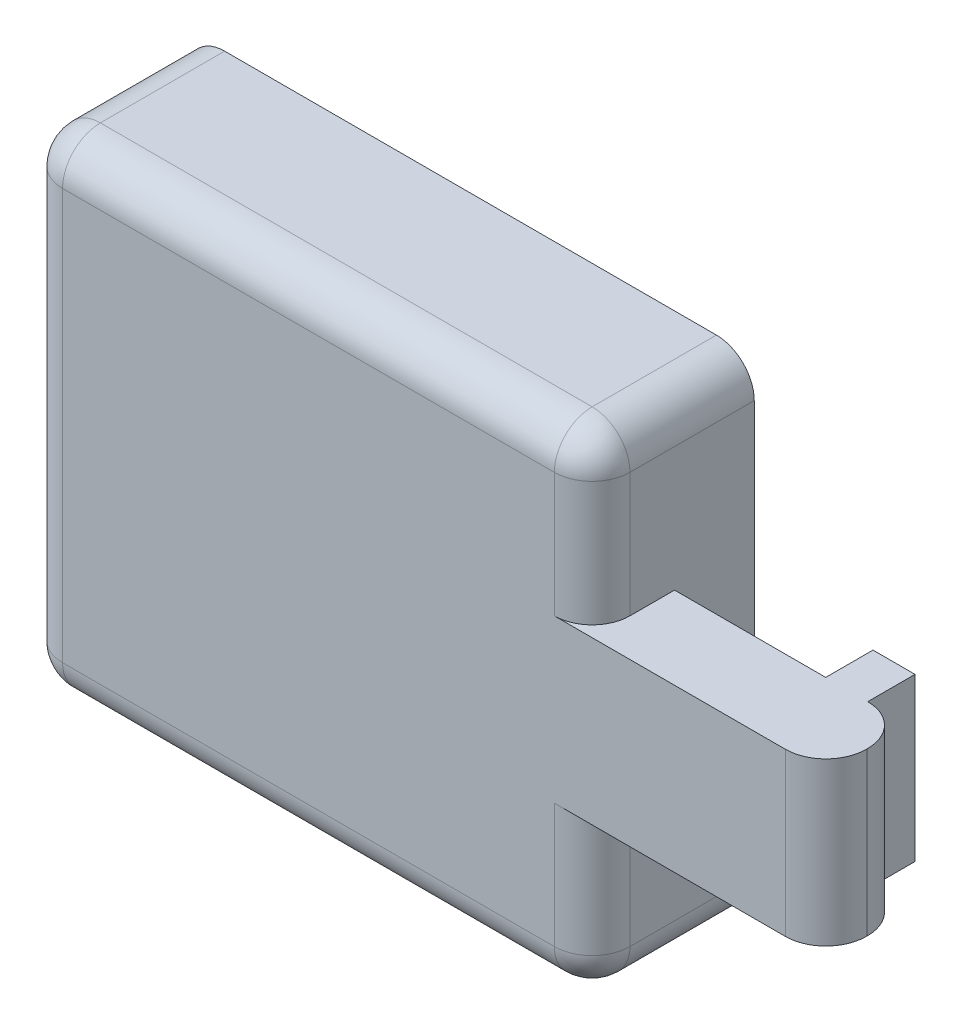
ISO-10303-21;
HEADER;
FILE_DESCRIPTION(('STEP AP214'),'2;1');
FILE_NAME('part.step','',(''),(''),'','','');
FILE_SCHEMA(('AUTOMOTIVE_DESIGN { 1 0 10303 214 1 1 1 1 }'));
ENDSEC;
DATA;
#1=APPLICATION_CONTEXT('core data for automotive mechanical design processes');
#2=APPLICATION_PROTOCOL_DEFINITION('international standard','automotive_design',2000,#1);
#3=PRODUCT_CONTEXT('',#1,'mechanical');
#4=PRODUCT('Part','Part','',(#3));
#5=PRODUCT_RELATED_PRODUCT_CATEGORY('part','',(#4));
#6=PRODUCT_DEFINITION_FORMATION('','',#4);
#7=PRODUCT_DEFINITION_CONTEXT('part definition',#1,'design');
#8=PRODUCT_DEFINITION('design','',#6,#7);
#9=PRODUCT_DEFINITION_SHAPE('','',#8);
#10=(LENGTH_UNIT() NAMED_UNIT(*) SI_UNIT(.MILLI.,.METRE.));
#11=(NAMED_UNIT(*) PLANE_ANGLE_UNIT() SI_UNIT($,.RADIAN.));
#12=(NAMED_UNIT(*) SI_UNIT($,.STERADIAN.) SOLID_ANGLE_UNIT());
#13=UNCERTAINTY_MEASURE_WITH_UNIT(LENGTH_MEASURE(1.E-05),#10,'distance_accuracy_value','');
#14=(GEOMETRIC_REPRESENTATION_CONTEXT(3) GLOBAL_UNCERTAINTY_ASSIGNED_CONTEXT((#13)) GLOBAL_UNIT_ASSIGNED_CONTEXT((#10,
#11,#12)) REPRESENTATION_CONTEXT('',''));
#15=CARTESIAN_POINT('',(0.,0.,0.));
#16=DIRECTION('',(0.,0.,1.));
#17=DIRECTION('',(1.,0.,0.));
#18=AXIS2_PLACEMENT_3D('',#15,#16,#17);
#19=CARTESIAN_POINT('',(-47.0356427146939,22.6345392216122,0.59));
#20=DIRECTION('',(0.,0.,1.));
#21=DIRECTION('',(0.,-1.,0.));
#22=AXIS2_PLACEMENT_3D('',#19,#20,#21);
#23=PLANE('',#22);
#24=DIRECTION('',(0.,1.,0.));
#25=VECTOR('',#24,1.);
#26=CARTESIAN_POINT('',(-47.646704212795,22.6345392216122,0.59));
#27=LINE('',#26,#25);
#28=CARTESIAN_POINT('',(-47.646704212795,21.4345392216122,0.59));
#29=VERTEX_POINT('',#28);
#30=CARTESIAN_POINT('',(-47.646704212795,22.6345392216122,0.59));
#31=VERTEX_POINT('',#30);
#32=EDGE_CURVE('E56',#29,#31,#27,.T.);
#33=ORIENTED_EDGE('',*,*,#32,.F.);
#34=DIRECTION('',(-1.,0.,0.));
#35=VECTOR('',#34,1.);
#36=CARTESIAN_POINT('',(-47.0356427146939,21.4345392216122,0.59));
#37=LINE('',#36,#35);
#38=CARTESIAN_POINT('',(-48.7656427146939,21.4345392216122,0.59));
#39=VERTEX_POINT('',#38);
#40=EDGE_CURVE('E211',#29,#39,#37,.T.);
#41=ORIENTED_EDGE('',*,*,#40,.T.);
#42=DIRECTION('',(0.,1.,0.));
#43=VECTOR('',#42,1.);
#44=CARTESIAN_POINT('',(-48.7656427146939,22.6345392216122,0.59));
#45=LINE('',#44,#43);
#46=CARTESIAN_POINT('',(-48.7656427146939,22.6345392216122,0.59));
#47=VERTEX_POINT('',#46);
#48=EDGE_CURVE('E212',#39,#47,#45,.T.);
#49=ORIENTED_EDGE('',*,*,#48,.T.);
#50=DIRECTION('',(-1.,0.,0.));
#51=VECTOR('',#50,1.);
#52=CARTESIAN_POINT('',(-47.0356427146939,22.6345392216122,0.59));
#53=LINE('',#52,#51);
#54=EDGE_CURVE('E52',#31,#47,#53,.T.);
#55=ORIENTED_EDGE('',*,*,#54,.F.);
#56=EDGE_LOOP('',(#33,#41,#49,#55));
#57=FACE_BOUND('',#56,.T.);
#58=ADVANCED_FACE('F37',(#57),#23,.F.);
#59=CARTESIAN_POINT('',(-48.7656427146939,23.8345392216122,1.2));
#60=DIRECTION('',(-1.,0.,0.));
#61=DIRECTION('',(0.,0.,1.));
#62=AXIS2_PLACEMENT_3D('',#59,#60,#61);
#63=PLANE('',#62);
#64=DIRECTION('',(0.,1.,0.));
#65=VECTOR('',#64,1.);
#66=CARTESIAN_POINT('',(-48.7656427146939,23.8345392216122,0.));
#67=LINE('',#66,#65);
#68=CARTESIAN_POINT('',(-48.7656427146939,20.5145392216122,0.));
#69=VERTEX_POINT('',#68);
#70=CARTESIAN_POINT('',(-48.7656427146939,23.5545392216122,0.));
#71=VERTEX_POINT('',#70);
#72=EDGE_CURVE('E232',#69,#71,#67,.T.);
#73=ORIENTED_EDGE('',*,*,#72,.T.);
#74=DIRECTION('',(0.,0.,-1.));
#75=VECTOR('',#74,1.);
#76=CARTESIAN_POINT('',(-48.7656427146939,23.5545392216122,1.2));
#77=LINE('',#76,#75);
#78=CARTESIAN_POINT('',(-48.7656427146939,23.5545392216122,0.92));
#79=VERTEX_POINT('',#78);
#80=EDGE_CURVE('E271',#71,#79,#77,.F.);
#81=ORIENTED_EDGE('',*,*,#80,.T.);
#82=DIRECTION('',(0.,1.,0.));
#83=VECTOR('',#82,1.);
#84=CARTESIAN_POINT('',(-48.7656427146939,22.6345392216122,0.92));
#85=LINE('',#84,#83);
#86=CARTESIAN_POINT('',(-48.7656427146939,22.6345392216122,0.92));
#87=VERTEX_POINT('',#86);
#88=EDGE_CURVE('E269',#79,#87,#85,.F.);
#89=ORIENTED_EDGE('',*,*,#88,.T.);
#90=DIRECTION('',(0.,0.,1.));
#91=VECTOR('',#90,1.);
#92=CARTESIAN_POINT('',(-48.7656427146939,22.6345392216122,0.59));
#93=LINE('',#92,#91);
#94=EDGE_CURVE('E214',#47,#87,#93,.T.);
#95=ORIENTED_EDGE('',*,*,#94,.F.);
#96=ORIENTED_EDGE('',*,*,#48,.F.);
#97=DIRECTION('',(0.,0.,-1.));
#98=VECTOR('',#97,1.);
#99=CARTESIAN_POINT('',(-48.7656427146939,21.4345392216122,0.59));
#100=LINE('',#99,#98);
#101=CARTESIAN_POINT('',(-48.7656427146939,21.4345392216122,0.92));
#102=VERTEX_POINT('',#101);
#103=EDGE_CURVE('E208',#102,#39,#100,.T.);
#104=ORIENTED_EDGE('',*,*,#103,.F.);
#105=DIRECTION('',(0.,1.,0.));
#106=VECTOR('',#105,1.);
#107=CARTESIAN_POINT('',(-48.7656427146939,20.2345392216122,0.92));
#108=LINE('',#107,#106);
#109=CARTESIAN_POINT('',(-48.7656427146939,20.5145392216122,0.92));
#110=VERTEX_POINT('',#109);
#111=EDGE_CURVE('E265',#102,#110,#108,.F.);
#112=ORIENTED_EDGE('',*,*,#111,.T.);
#113=DIRECTION('',(0.,0.,-1.));
#114=VECTOR('',#113,1.);
#115=CARTESIAN_POINT('',(-48.7656427146939,20.5145392216122,1.2));
#116=LINE('',#115,#114);
#117=EDGE_CURVE('E267',#110,#69,#116,.T.);
#118=ORIENTED_EDGE('',*,*,#117,.T.);
#119=EDGE_LOOP('',(#73,#81,#89,#95,#96,#104,#112,#118));
#120=FACE_BOUND('',#119,.T.);
#121=ADVANCED_FACE('F360',(#120),#63,.F.);
#122=CARTESIAN_POINT('',(-52.9656427146939,23.8345392216122,1.2));
#123=DIRECTION('',(1.,0.,0.));
#124=DIRECTION('',(0.,0.,-1.));
#125=AXIS2_PLACEMENT_3D('',#122,#123,#124);
#126=PLANE('',#125);
#127=DIRECTION('',(0.,-1.,0.));
#128=VECTOR('',#127,1.);
#129=CARTESIAN_POINT('',(-52.9656427146939,23.8345392216122,0.));
#130=LINE('',#129,#128);
#131=CARTESIAN_POINT('',(-52.9656427146939,23.5545392216122,0.));
#132=VERTEX_POINT('',#131);
#133=CARTESIAN_POINT('',(-52.9656427146939,20.5145392216122,0.));
#134=VERTEX_POINT('',#133);
#135=EDGE_CURVE('E226',#132,#134,#130,.T.);
#136=ORIENTED_EDGE('',*,*,#135,.T.);
#137=DIRECTION('',(0.,0.,-1.));
#138=VECTOR('',#137,1.);
#139=CARTESIAN_POINT('',(-52.9656427146939,20.5145392216122,1.2));
#140=LINE('',#139,#138);
#141=CARTESIAN_POINT('',(-52.9656427146939,20.5145392216122,0.92));
#142=VERTEX_POINT('',#141);
#143=EDGE_CURVE('E257',#134,#142,#140,.F.);
#144=ORIENTED_EDGE('',*,*,#143,.T.);
#145=DIRECTION('',(0.,-1.,0.));
#146=VECTOR('',#145,1.);
#147=CARTESIAN_POINT('',(-52.9656427146939,23.8345392216122,0.92));
#148=LINE('',#147,#146);
#149=CARTESIAN_POINT('',(-52.9656427146939,23.5545392216122,0.92));
#150=VERTEX_POINT('',#149);
#151=EDGE_CURVE('E253',#142,#150,#148,.F.);
#152=ORIENTED_EDGE('',*,*,#151,.T.);
#153=DIRECTION('',(0.,0.,-1.));
#154=VECTOR('',#153,1.);
#155=CARTESIAN_POINT('',(-52.9656427146939,23.5545392216122,1.2));
#156=LINE('',#155,#154);
#157=EDGE_CURVE('E255',#150,#132,#156,.T.);
#158=ORIENTED_EDGE('',*,*,#157,.T.);
#159=EDGE_LOOP('',(#136,#144,#152,#158));
#160=FACE_BOUND('',#159,.T.);
#161=ADVANCED_FACE('F436',(#160),#126,.F.);
#162=CARTESIAN_POINT('',(-52.9656427146939,20.2345392216122,1.2));
#163=DIRECTION('',(0.,1.,0.));
#164=DIRECTION('',(0.,0.,1.));
#165=AXIS2_PLACEMENT_3D('',#162,#163,#164);
#166=PLANE('',#165);
#167=DIRECTION('',(1.,0.,0.));
#168=VECTOR('',#167,1.);
#169=CARTESIAN_POINT('',(-52.9656427146939,20.2345392216122,0.92));
#170=LINE('',#169,#168);
#171=CARTESIAN_POINT('',(-49.0456427146939,20.2345392216122,0.92));
#172=VERTEX_POINT('',#171);
#173=CARTESIAN_POINT('',(-52.6856427146939,20.2345392216122,0.92));
#174=VERTEX_POINT('',#173);
#175=EDGE_CURVE('E238',#172,#174,#170,.F.);
#176=ORIENTED_EDGE('',*,*,#175,.T.);
#177=DIRECTION('',(0.,0.,-1.));
#178=VECTOR('',#177,1.);
#179=CARTESIAN_POINT('',(-52.6856427146939,20.2345392216122,1.2));
#180=LINE('',#179,#178);
#181=CARTESIAN_POINT('',(-52.6856427146939,20.2345392216122,0.));
#182=VERTEX_POINT('',#181);
#183=EDGE_CURVE('E242',#174,#182,#180,.T.);
#184=ORIENTED_EDGE('',*,*,#183,.T.);
#185=DIRECTION('',(1.,0.,0.));
#186=VECTOR('',#185,1.);
#187=CARTESIAN_POINT('',(-52.9656427146939,20.2345392216122,0.));
#188=LINE('',#187,#186);
#189=CARTESIAN_POINT('',(-49.0456427146939,20.2345392216122,0.));
#190=VERTEX_POINT('',#189);
#191=EDGE_CURVE('E229',#182,#190,#188,.T.);
#192=ORIENTED_EDGE('',*,*,#191,.T.);
#193=DIRECTION('',(0.,0.,-1.));
#194=VECTOR('',#193,1.);
#195=CARTESIAN_POINT('',(-49.0456427146939,20.2345392216122,1.2));
#196=LINE('',#195,#194);
#197=EDGE_CURVE('E240',#190,#172,#196,.F.);
#198=ORIENTED_EDGE('',*,*,#197,.T.);
#199=EDGE_LOOP('',(#176,#184,#192,#198));
#200=FACE_BOUND('',#199,.T.);
#201=ADVANCED_FACE('F447',(#200),#166,.F.);
#202=CARTESIAN_POINT('',(-52.9656427146939,23.8345392216122,1.2));
#203=DIRECTION('',(0.,-1.,0.));
#204=DIRECTION('',(0.,0.,-1.));
#205=AXIS2_PLACEMENT_3D('',#202,#203,#204);
#206=PLANE('',#205);
#207=DIRECTION('',(-1.,0.,0.));
#208=VECTOR('',#207,1.);
#209=CARTESIAN_POINT('',(-52.9656427146939,23.8345392216122,0.));
#210=LINE('',#209,#208);
#211=CARTESIAN_POINT('',(-49.0456427146939,23.8345392216122,0.));
#212=VERTEX_POINT('',#211);
#213=CARTESIAN_POINT('',(-52.6856427146939,23.8345392216122,0.));
#214=VERTEX_POINT('',#213);
#215=EDGE_CURVE('E235',#212,#214,#210,.T.);
#216=ORIENTED_EDGE('',*,*,#215,.T.);
#217=DIRECTION('',(0.,0.,-1.));
#218=VECTOR('',#217,1.);
#219=CARTESIAN_POINT('',(-52.6856427146939,23.8345392216122,1.2));
#220=LINE('',#219,#218);
#221=CARTESIAN_POINT('',(-52.6856427146939,23.8345392216122,0.92));
#222=VERTEX_POINT('',#221);
#223=EDGE_CURVE('E263',#214,#222,#220,.F.);
#224=ORIENTED_EDGE('',*,*,#223,.T.);
#225=DIRECTION('',(-1.,0.,0.));
#226=VECTOR('',#225,1.);
#227=CARTESIAN_POINT('',(-48.7656427146939,23.8345392216122,0.92));
#228=LINE('',#227,#226);
#229=CARTESIAN_POINT('',(-49.0456427146939,23.8345392216122,0.92));
#230=VERTEX_POINT('',#229);
#231=EDGE_CURVE('E259',#222,#230,#228,.F.);
#232=ORIENTED_EDGE('',*,*,#231,.T.);
#233=DIRECTION('',(0.,0.,-1.));
#234=VECTOR('',#233,1.);
#235=CARTESIAN_POINT('',(-49.0456427146939,23.8345392216122,1.2));
#236=LINE('',#235,#234);
#237=EDGE_CURVE('E261',#230,#212,#236,.T.);
#238=ORIENTED_EDGE('',*,*,#237,.T.);
#239=EDGE_LOOP('',(#216,#224,#232,#238));
#240=FACE_BOUND('',#239,.T.);
#241=ADVANCED_FACE('F443',(#240),#206,.F.);
#242=CARTESIAN_POINT('',(0.,0.,1.2));
#243=DIRECTION('',(0.,0.,1.));
#244=DIRECTION('',(1.,0.,0.));
#245=AXIS2_PLACEMENT_3D('',#242,#243,#244);
#246=PLANE('',#245);
#247=DIRECTION('',(-1.,0.,0.));
#248=VECTOR('',#247,1.);
#249=CARTESIAN_POINT('',(-47.0356427146939,21.4345392216122,1.2));
#250=LINE('',#249,#248);
#251=CARTESIAN_POINT('',(-47.3356427146939,21.4345392216122,1.2));
#252=VERTEX_POINT('',#251);
#253=CARTESIAN_POINT('',(-49.0456427146939,21.4345392216122,1.2));
#254=VERTEX_POINT('',#253);
#255=EDGE_CURVE('E221',#252,#254,#250,.T.);
#256=ORIENTED_EDGE('',*,*,#255,.F.);
#257=DIRECTION('',(0.,-1.,0.));
#258=VECTOR('',#257,1.);
#259=CARTESIAN_POINT('',(-47.3356427146939,22.6345392216122,1.2));
#260=LINE('',#259,#258);
#261=CARTESIAN_POINT('',(-47.3356427146939,22.6345392216122,1.2));
#262=VERTEX_POINT('',#261);
#263=EDGE_CURVE('E11',#252,#262,#260,.F.);
#264=ORIENTED_EDGE('',*,*,#263,.T.);
#265=DIRECTION('',(-1.,0.,0.));
#266=VECTOR('',#265,1.);
#267=CARTESIAN_POINT('',(-47.0356427146939,22.6345392216122,1.2));
#268=LINE('',#267,#266);
#269=CARTESIAN_POINT('',(-49.0456427146939,22.6345392216122,1.2));
#270=VERTEX_POINT('',#269);
#271=EDGE_CURVE('E223',#262,#270,#268,.T.);
#272=ORIENTED_EDGE('',*,*,#271,.T.);
#273=DIRECTION('',(0.,1.,0.));
#274=VECTOR('',#273,1.);
#275=CARTESIAN_POINT('',(-49.0456427146939,23.8345392216122,1.2));
#276=LINE('',#275,#274);
#277=CARTESIAN_POINT('',(-49.0456427146939,23.5545392216122,1.2));
#278=VERTEX_POINT('',#277);
#279=EDGE_CURVE('E282',#270,#278,#276,.T.);
#280=ORIENTED_EDGE('',*,*,#279,.T.);
#281=DIRECTION('',(-1.,0.,0.));
#282=VECTOR('',#281,1.);
#283=CARTESIAN_POINT('',(-52.9656427146939,23.5545392216122,1.2));
#284=LINE('',#283,#282);
#285=CARTESIAN_POINT('',(-52.6856427146939,23.5545392216122,1.2));
#286=VERTEX_POINT('',#285);
#287=EDGE_CURVE('E277',#278,#286,#284,.T.);
#288=ORIENTED_EDGE('',*,*,#287,.T.);
#289=DIRECTION('',(0.,-1.,0.));
#290=VECTOR('',#289,1.);
#291=CARTESIAN_POINT('',(-52.6856427146939,20.2345392216122,1.2));
#292=LINE('',#291,#290);
#293=CARTESIAN_POINT('',(-52.6856427146939,20.5145392216122,1.2));
#294=VERTEX_POINT('',#293);
#295=EDGE_CURVE('E273',#286,#294,#292,.T.);
#296=ORIENTED_EDGE('',*,*,#295,.T.);
#297=DIRECTION('',(1.,0.,0.));
#298=VECTOR('',#297,1.);
#299=CARTESIAN_POINT('',(-48.7656427146939,20.5145392216122,1.2));
#300=LINE('',#299,#298);
#301=CARTESIAN_POINT('',(-49.0456427146939,20.5145392216122,1.2));
#302=VERTEX_POINT('',#301);
#303=EDGE_CURVE('E275',#294,#302,#300,.T.);
#304=ORIENTED_EDGE('',*,*,#303,.T.);
#305=DIRECTION('',(0.,1.,0.));
#306=VECTOR('',#305,1.);
#307=CARTESIAN_POINT('',(-49.0456427146939,21.4345392216122,1.2));
#308=LINE('',#307,#306);
#309=EDGE_CURVE('E279',#302,#254,#308,.T.);
#310=ORIENTED_EDGE('',*,*,#309,.T.);
#311=EDGE_LOOP('',(#256,#264,#272,#280,#288,#296,#304,#310));
#312=FACE_BOUND('',#311,.T.);
#313=ADVANCED_FACE('F349',(#312),#246,.T.);
#314=CARTESIAN_POINT('',(0.,0.,0.));
#315=DIRECTION('',(0.,0.,1.));
#316=DIRECTION('',(1.,0.,0.));
#317=AXIS2_PLACEMENT_3D('',#314,#315,#316);
#318=PLANE('',#317);
#319=ORIENTED_EDGE('',*,*,#191,.F.);
#320=CARTESIAN_POINT('',(-52.6856427146939,20.5145392216122,0.));
#321=DIRECTION('',(0.,0.,1.));
#322=DIRECTION('',(1.,0.,0.));
#323=AXIS2_PLACEMENT_3D('',#320,#321,#322);
#324=CIRCLE('',#323,0.28);
#325=EDGE_CURVE('E251',#182,#134,#324,.F.);
#326=ORIENTED_EDGE('',*,*,#325,.T.);
#327=ORIENTED_EDGE('',*,*,#135,.F.);
#328=CARTESIAN_POINT('',(-52.6856427146939,23.5545392216122,0.));
#329=DIRECTION('',(0.,0.,1.));
#330=DIRECTION('',(1.,0.,0.));
#331=AXIS2_PLACEMENT_3D('',#328,#329,#330);
#332=CIRCLE('',#331,0.28);
#333=EDGE_CURVE('E249',#132,#214,#332,.F.);
#334=ORIENTED_EDGE('',*,*,#333,.T.);
#335=ORIENTED_EDGE('',*,*,#215,.F.);
#336=CARTESIAN_POINT('',(-49.0456427146939,23.5545392216122,0.));
#337=DIRECTION('',(0.,0.,1.));
#338=DIRECTION('',(1.,0.,0.));
#339=AXIS2_PLACEMENT_3D('',#336,#337,#338);
#340=CIRCLE('',#339,0.28);
#341=EDGE_CURVE('E247',#212,#71,#340,.F.);
#342=ORIENTED_EDGE('',*,*,#341,.T.);
#343=ORIENTED_EDGE('',*,*,#72,.F.);
#344=CARTESIAN_POINT('',(-49.0456427146939,20.5145392216122,0.));
#345=DIRECTION('',(0.,0.,1.));
#346=DIRECTION('',(1.,0.,0.));
#347=AXIS2_PLACEMENT_3D('',#344,#345,#346);
#348=CIRCLE('',#347,0.28);
#349=EDGE_CURVE('E245',#69,#190,#348,.F.);
#350=ORIENTED_EDGE('',*,*,#349,.T.);
#351=EDGE_LOOP('',(#319,#326,#327,#334,#335,#342,#343,#350));
#352=FACE_BOUND('',#351,.T.);
#353=ADVANCED_FACE('F413',(#352),#318,.F.);
#354=CARTESIAN_POINT('',(-47.0356427146939,22.6345392216122,0.59));
#355=DIRECTION('',(0.,-1.,0.));
#356=DIRECTION('',(0.,0.,-1.));
#357=AXIS2_PLACEMENT_3D('',#354,#355,#356);
#358=PLANE('',#357);
#359=DIRECTION('',(0.,0.,1.));
#360=VECTOR('',#359,1.);
#361=CARTESIAN_POINT('',(-47.0356427146939,22.6345392216122,0.59));
#362=LINE('',#361,#360);
#363=CARTESIAN_POINT('',(-47.0356427146939,22.6345392216122,0.89));
#364=VERTEX_POINT('',#363);
#365=CARTESIAN_POINT('',(-47.0356427146939,22.6345392216122,0.9));
#366=VERTEX_POINT('',#365);
#367=EDGE_CURVE('E204',#364,#366,#362,.T.);
#368=ORIENTED_EDGE('',*,*,#367,.F.);
#369=CARTESIAN_POINT('',(-47.3356427146939,22.6345392216122,0.89));
#370=DIRECTION('',(0.,-1.,0.));
#371=DIRECTION('',(0.,0.,-1.));
#372=AXIS2_PLACEMENT_3D('',#369,#370,#371);
#373=CIRCLE('',#372,0.3);
#374=CARTESIAN_POINT('',(-47.3356427146939,22.6345392216122,0.59));
#375=VERTEX_POINT('',#374);
#376=EDGE_CURVE('E328',#364,#375,#373,.F.);
#377=ORIENTED_EDGE('',*,*,#376,.T.);
#378=DIRECTION('',(0.,0.,1.));
#379=VECTOR('',#378,1.);
#380=CARTESIAN_POINT('',(-47.3356427146939,22.6345392216122,0.24));
#381=LINE('',#380,#379);
#382=CARTESIAN_POINT('',(-47.3356427146939,22.6345392216122,0.24));
#383=VERTEX_POINT('',#382);
#384=EDGE_CURVE('E342',#383,#375,#381,.T.);
#385=ORIENTED_EDGE('',*,*,#384,.F.);
#386=DIRECTION('',(1.,0.,0.));
#387=VECTOR('',#386,1.);
#388=CARTESIAN_POINT('',(-47.3356427146939,22.6345392216122,0.24));
#389=LINE('',#388,#387);
#390=CARTESIAN_POINT('',(-47.646704212795,22.6345392216122,0.24));
#391=VERTEX_POINT('',#390);
#392=EDGE_CURVE('E187',#391,#383,#389,.T.);
#393=ORIENTED_EDGE('',*,*,#392,.F.);
#394=DIRECTION('',(0.,0.,1.));
#395=VECTOR('',#394,1.);
#396=CARTESIAN_POINT('',(-47.646704212795,22.6345392216122,0.24));
#397=LINE('',#396,#395);
#398=EDGE_CURVE('E200',#391,#31,#397,.T.);
#399=ORIENTED_EDGE('',*,*,#398,.T.);
#400=ORIENTED_EDGE('',*,*,#54,.T.);
#401=ORIENTED_EDGE('',*,*,#94,.T.);
#402=CARTESIAN_POINT('',(-49.0456427146939,22.6345392216122,0.92));
#403=DIRECTION('',(0.,-1.,0.));
#404=DIRECTION('',(0.,0.,-1.));
#405=AXIS2_PLACEMENT_3D('',#402,#403,#404);
#406=CIRCLE('',#405,0.28);
#407=EDGE_CURVE('E284',#87,#270,#406,.T.);
#408=ORIENTED_EDGE('',*,*,#407,.T.);
#409=ORIENTED_EDGE('',*,*,#271,.F.);
#410=CARTESIAN_POINT('',(-47.3356427146939,22.6345392216122,0.9));
#411=DIRECTION('',(0.,-1.,0.));
#412=DIRECTION('',(0.,0.,-1.));
#413=AXIS2_PLACEMENT_3D('',#410,#411,#412);
#414=CIRCLE('',#413,0.3);
#415=EDGE_CURVE('E326',#262,#366,#414,.F.);
#416=ORIENTED_EDGE('',*,*,#415,.T.);
#417=EDGE_LOOP('',(#368,#377,#385,#393,#399,#400,#401,#408,#409,#416));
#418=FACE_BOUND('',#417,.T.);
#419=ADVANCED_FACE('F341',(#418),#358,.F.);
#420=CARTESIAN_POINT('',(-47.0356427146939,21.4345392216122,0.59));
#421=DIRECTION('',(0.,1.,0.));
#422=DIRECTION('',(0.,0.,1.));
#423=AXIS2_PLACEMENT_3D('',#420,#421,#422);
#424=PLANE('',#423);
#425=ORIENTED_EDGE('',*,*,#40,.F.);
#426=DIRECTION('',(0.,0.,1.));
#427=VECTOR('',#426,1.);
#428=CARTESIAN_POINT('',(-47.646704212795,21.4345392216122,0.24));
#429=LINE('',#428,#427);
#430=CARTESIAN_POINT('',(-47.646704212795,21.4345392216122,0.24));
#431=VERTEX_POINT('',#430);
#432=EDGE_CURVE('E178',#431,#29,#429,.T.);
#433=ORIENTED_EDGE('',*,*,#432,.F.);
#434=DIRECTION('',(-1.,0.,0.));
#435=VECTOR('',#434,1.);
#436=CARTESIAN_POINT('',(-47.3356427146939,21.4345392216122,0.24));
#437=LINE('',#436,#435);
#438=CARTESIAN_POINT('',(-47.3356427146939,21.4345392216122,0.24));
#439=VERTEX_POINT('',#438);
#440=EDGE_CURVE('E171',#439,#431,#437,.T.);
#441=ORIENTED_EDGE('',*,*,#440,.F.);
#442=DIRECTION('',(0.,0.,1.));
#443=VECTOR('',#442,1.);
#444=CARTESIAN_POINT('',(-47.3356427146939,21.4345392216122,0.24));
#445=LINE('',#444,#443);
#446=CARTESIAN_POINT('',(-47.3356427146939,21.4345392216122,0.59));
#447=VERTEX_POINT('',#446);
#448=EDGE_CURVE('E175',#439,#447,#445,.T.);
#449=ORIENTED_EDGE('',*,*,#448,.T.);
#450=CARTESIAN_POINT('',(-47.3356427146939,21.4345392216122,0.89));
#451=DIRECTION('',(0.,1.,0.));
#452=DIRECTION('',(0.,0.,1.));
#453=AXIS2_PLACEMENT_3D('',#450,#451,#452);
#454=CIRCLE('',#453,0.3);
#455=CARTESIAN_POINT('',(-47.0356427146939,21.4345392216122,0.89));
#456=VERTEX_POINT('',#455);
#457=EDGE_CURVE('E45',#447,#456,#454,.F.);
#458=ORIENTED_EDGE('',*,*,#457,.T.);
#459=DIRECTION('',(0.,0.,-1.));
#460=VECTOR('',#459,1.);
#461=CARTESIAN_POINT('',(-47.0356427146939,21.4345392216122,0.59));
#462=LINE('',#461,#460);
#463=CARTESIAN_POINT('',(-47.0356427146939,21.4345392216122,0.9));
#464=VERTEX_POINT('',#463);
#465=EDGE_CURVE('E207',#464,#456,#462,.T.);
#466=ORIENTED_EDGE('',*,*,#465,.F.);
#467=CARTESIAN_POINT('',(-47.3356427146939,21.4345392216122,0.9));
#468=DIRECTION('',(0.,1.,0.));
#469=DIRECTION('',(0.,0.,1.));
#470=AXIS2_PLACEMENT_3D('',#467,#468,#469);
#471=CIRCLE('',#470,0.3);
#472=EDGE_CURVE('E331',#464,#252,#471,.F.);
#473=ORIENTED_EDGE('',*,*,#472,.T.);
#474=ORIENTED_EDGE('',*,*,#255,.T.);
#475=CARTESIAN_POINT('',(-49.0456427146939,21.4345392216122,0.92));
#476=DIRECTION('',(0.,1.,0.));
#477=DIRECTION('',(0.,0.,1.));
#478=AXIS2_PLACEMENT_3D('',#475,#476,#477);
#479=CIRCLE('',#478,0.28);
#480=EDGE_CURVE('E287',#254,#102,#479,.T.);
#481=ORIENTED_EDGE('',*,*,#480,.T.);
#482=ORIENTED_EDGE('',*,*,#103,.T.);
#483=EDGE_LOOP('',(#425,#433,#441,#449,#458,#466,#473,#474,#481,#482));
#484=FACE_BOUND('',#483,.T.);
#485=ADVANCED_FACE('F173',(#484),#424,.F.);
#486=CARTESIAN_POINT('',(-47.0356427146939,0.,0.));
#487=DIRECTION('',(-1.,0.,0.));
#488=DIRECTION('',(0.,0.,1.));
#489=AXIS2_PLACEMENT_3D('',#486,#487,#488);
#490=PLANE('',#489);
#491=ORIENTED_EDGE('',*,*,#465,.T.);
#492=DIRECTION('',(0.,1.,0.));
#493=VECTOR('',#492,1.);
#494=CARTESIAN_POINT('',(-47.0356427146939,0.,0.889999999999996));
#495=LINE('',#494,#493);
#496=EDGE_CURVE('E323',#456,#364,#495,.T.);
#497=ORIENTED_EDGE('',*,*,#496,.T.);
#498=ORIENTED_EDGE('',*,*,#367,.T.);
#499=DIRECTION('',(0.,-1.,0.));
#500=VECTOR('',#499,1.);
#501=CARTESIAN_POINT('',(-47.0356427146939,21.4345392216122,0.9));
#502=LINE('',#501,#500);
#503=EDGE_CURVE('E288',#366,#464,#502,.T.);
#504=ORIENTED_EDGE('',*,*,#503,.T.);
#505=EDGE_LOOP('',(#491,#497,#498,#504));
#506=FACE_BOUND('',#505,.T.);
#507=ADVANCED_FACE('F336',(#506),#490,.F.);
#508=CARTESIAN_POINT('',(-49.0456427146939,23.5545392216122,1.2));
#509=DIRECTION('',(0.,0.,-1.));
#510=DIRECTION('',(-1.,0.,0.));
#511=AXIS2_PLACEMENT_3D('',#508,#509,#510);
#512=CYLINDRICAL_SURFACE('',#511,0.28);
#513=ORIENTED_EDGE('',*,*,#341,.F.);
#514=ORIENTED_EDGE('',*,*,#237,.F.);
#515=CARTESIAN_POINT('',(-49.0456427146939,23.5545392216122,0.92));
#516=DIRECTION('',(0.,0.,1.));
#517=DIRECTION('',(1.,0.,0.));
#518=AXIS2_PLACEMENT_3D('',#515,#516,#517);
#519=CIRCLE('',#518,0.28);
#520=EDGE_CURVE('E215',#79,#230,#519,.T.);
#521=ORIENTED_EDGE('',*,*,#520,.F.);
#522=ORIENTED_EDGE('',*,*,#80,.F.);
#523=EDGE_LOOP('',(#513,#514,#521,#522));
#524=FACE_BOUND('',#523,.T.);
#525=ADVANCED_FACE('F418',(#524),#512,.T.);
#526=CARTESIAN_POINT('',(-49.0456427146939,0.,0.92));
#527=DIRECTION('',(0.,-1.,0.));
#528=DIRECTION('',(0.,0.,-1.));
#529=AXIS2_PLACEMENT_3D('',#526,#527,#528);
#530=CYLINDRICAL_SURFACE('',#529,0.28);
#531=ORIENTED_EDGE('',*,*,#407,.F.);
#532=ORIENTED_EDGE('',*,*,#88,.F.);
#533=CARTESIAN_POINT('',(-49.0456427146939,23.5545392216122,0.92));
#534=DIRECTION('',(0.,1.,0.));
#535=DIRECTION('',(0.,0.,1.));
#536=AXIS2_PLACEMENT_3D('',#533,#534,#535);
#537=CIRCLE('',#536,0.28);
#538=EDGE_CURVE('E316',#278,#79,#537,.T.);
#539=ORIENTED_EDGE('',*,*,#538,.F.);
#540=ORIENTED_EDGE('',*,*,#279,.F.);
#541=EDGE_LOOP('',(#531,#532,#539,#540));
#542=FACE_BOUND('',#541,.T.);
#543=ADVANCED_FACE('F375',(#542),#530,.T.);
#544=CARTESIAN_POINT('',(-49.0456427146939,23.5545392216122,0.92));
#545=DIRECTION('',(0.,0.,1.));
#546=DIRECTION('',(1.,0.,0.));
#547=AXIS2_PLACEMENT_3D('',#544,#545,#546);
#548=SPHERICAL_SURFACE('',#547,0.28);
#549=ORIENTED_EDGE('',*,*,#538,.T.);
#550=ORIENTED_EDGE('',*,*,#520,.T.);
#551=CARTESIAN_POINT('',(-49.0456427146939,23.5545392216122,0.92));
#552=DIRECTION('',(1.,0.,0.));
#553=DIRECTION('',(0.,0.,-1.));
#554=AXIS2_PLACEMENT_3D('',#551,#552,#553);
#555=CIRCLE('',#554,0.28);
#556=EDGE_CURVE('E313',#278,#230,#555,.F.);
#557=ORIENTED_EDGE('',*,*,#556,.F.);
#558=EDGE_LOOP('',(#549,#550,#557));
#559=FACE_BOUND('',#558,.T.);
#560=ADVANCED_FACE('F420',(#559),#548,.T.);
#561=CARTESIAN_POINT('',(-52.6856427146939,23.5545392216122,1.2));
#562=DIRECTION('',(0.,0.,-1.));
#563=DIRECTION('',(-1.,0.,0.));
#564=AXIS2_PLACEMENT_3D('',#561,#562,#563);
#565=CYLINDRICAL_SURFACE('',#564,0.28);
#566=ORIENTED_EDGE('',*,*,#333,.F.);
#567=ORIENTED_EDGE('',*,*,#157,.F.);
#568=CARTESIAN_POINT('',(-52.6856427146939,23.5545392216122,0.92));
#569=DIRECTION('',(0.,0.,1.));
#570=DIRECTION('',(1.,0.,0.));
#571=AXIS2_PLACEMENT_3D('',#568,#569,#570);
#572=CIRCLE('',#571,0.28);
#573=EDGE_CURVE('E310',#222,#150,#572,.T.);
#574=ORIENTED_EDGE('',*,*,#573,.F.);
#575=ORIENTED_EDGE('',*,*,#223,.F.);
#576=EDGE_LOOP('',(#566,#567,#574,#575));
#577=FACE_BOUND('',#576,.T.);
#578=ADVANCED_FACE('F422',(#577),#565,.T.);
#579=CARTESIAN_POINT('',(0.,23.5545392216122,0.92));
#580=DIRECTION('',(1.,0.,0.));
#581=DIRECTION('',(0.,0.,-1.));
#582=AXIS2_PLACEMENT_3D('',#579,#580,#581);
#583=CYLINDRICAL_SURFACE('',#582,0.28);
#584=ORIENTED_EDGE('',*,*,#556,.T.);
#585=ORIENTED_EDGE('',*,*,#231,.F.);
#586=CARTESIAN_POINT('',(-52.6856427146939,23.5545392216122,0.92));
#587=DIRECTION('',(-1.,0.,0.));
#588=DIRECTION('',(0.,0.,1.));
#589=AXIS2_PLACEMENT_3D('',#586,#587,#588);
#590=CIRCLE('',#589,0.28);
#591=EDGE_CURVE('E307',#286,#222,#590,.T.);
#592=ORIENTED_EDGE('',*,*,#591,.F.);
#593=ORIENTED_EDGE('',*,*,#287,.F.);
#594=EDGE_LOOP('',(#584,#585,#592,#593));
#595=FACE_BOUND('',#594,.T.);
#596=ADVANCED_FACE('F385',(#595),#583,.T.);
#597=CARTESIAN_POINT('',(-49.0456427146939,0.,0.92));
#598=DIRECTION('',(0.,-1.,0.));
#599=DIRECTION('',(0.,0.,-1.));
#600=AXIS2_PLACEMENT_3D('',#597,#598,#599);
#601=CYLINDRICAL_SURFACE('',#600,0.28);
#602=ORIENTED_EDGE('',*,*,#480,.F.);
#603=ORIENTED_EDGE('',*,*,#309,.F.);
#604=CARTESIAN_POINT('',(-49.0456427146939,20.5145392216122,0.92));
#605=DIRECTION('',(0.,-1.,0.));
#606=DIRECTION('',(0.,0.,-1.));
#607=AXIS2_PLACEMENT_3D('',#604,#605,#606);
#608=CIRCLE('',#607,0.28);
#609=EDGE_CURVE('E304',#110,#302,#608,.T.);
#610=ORIENTED_EDGE('',*,*,#609,.F.);
#611=ORIENTED_EDGE('',*,*,#111,.F.);
#612=EDGE_LOOP('',(#602,#603,#610,#611));
#613=FACE_BOUND('',#612,.T.);
#614=ADVANCED_FACE('F356',(#613),#601,.T.);
#615=CARTESIAN_POINT('',(-49.0456427146939,20.5145392216122,1.2));
#616=DIRECTION('',(0.,0.,-1.));
#617=DIRECTION('',(-1.,0.,0.));
#618=AXIS2_PLACEMENT_3D('',#615,#616,#617);
#619=CYLINDRICAL_SURFACE('',#618,0.28);
#620=ORIENTED_EDGE('',*,*,#349,.F.);
#621=ORIENTED_EDGE('',*,*,#117,.F.);
#622=CARTESIAN_POINT('',(-49.0456427146939,20.5145392216122,0.92));
#623=DIRECTION('',(0.,0.,1.));
#624=DIRECTION('',(1.,0.,0.));
#625=AXIS2_PLACEMENT_3D('',#622,#623,#624);
#626=CIRCLE('',#625,0.28);
#627=EDGE_CURVE('E301',#172,#110,#626,.T.);
#628=ORIENTED_EDGE('',*,*,#627,.F.);
#629=ORIENTED_EDGE('',*,*,#197,.F.);
#630=EDGE_LOOP('',(#620,#621,#628,#629));
#631=FACE_BOUND('',#630,.T.);
#632=ADVANCED_FACE('F408',(#631),#619,.T.);
#633=CARTESIAN_POINT('',(-52.6856427146939,23.5545392216122,0.92));
#634=DIRECTION('',(0.,0.,1.));
#635=DIRECTION('',(1.,0.,0.));
#636=AXIS2_PLACEMENT_3D('',#633,#634,#635);
#637=SPHERICAL_SURFACE('',#636,0.28);
#638=ORIENTED_EDGE('',*,*,#591,.T.);
#639=ORIENTED_EDGE('',*,*,#573,.T.);
#640=CARTESIAN_POINT('',(-52.6856427146939,23.5545392216122,0.92));
#641=DIRECTION('',(0.,1.,0.));
#642=DIRECTION('',(0.,0.,1.));
#643=AXIS2_PLACEMENT_3D('',#640,#641,#642);
#644=CIRCLE('',#643,0.28);
#645=EDGE_CURVE('E298',#286,#150,#644,.F.);
#646=ORIENTED_EDGE('',*,*,#645,.F.);
#647=EDGE_LOOP('',(#638,#639,#646));
#648=FACE_BOUND('',#647,.T.);
#649=ADVANCED_FACE('F388',(#648),#637,.T.);
#650=CARTESIAN_POINT('',(-49.0456427146939,20.5145392216122,0.92));
#651=DIRECTION('',(0.,0.,1.));
#652=DIRECTION('',(1.,0.,0.));
#653=AXIS2_PLACEMENT_3D('',#650,#651,#652);
#654=SPHERICAL_SURFACE('',#653,0.28);
#655=ORIENTED_EDGE('',*,*,#627,.T.);
#656=ORIENTED_EDGE('',*,*,#609,.T.);
#657=CARTESIAN_POINT('',(-49.0456427146939,20.5145392216122,0.92));
#658=DIRECTION('',(1.,0.,0.));
#659=DIRECTION('',(0.,0.,-1.));
#660=AXIS2_PLACEMENT_3D('',#657,#658,#659);
#661=CIRCLE('',#660,0.28);
#662=EDGE_CURVE('E295',#172,#302,#661,.F.);
#663=ORIENTED_EDGE('',*,*,#662,.F.);
#664=EDGE_LOOP('',(#655,#656,#663));
#665=FACE_BOUND('',#664,.T.);
#666=ADVANCED_FACE('F403',(#665),#654,.T.);
#667=CARTESIAN_POINT('',(-52.6856427146939,0.,0.92));
#668=DIRECTION('',(0.,1.,0.));
#669=DIRECTION('',(0.,0.,1.));
#670=AXIS2_PLACEMENT_3D('',#667,#668,#669);
#671=CYLINDRICAL_SURFACE('',#670,0.28);
#672=ORIENTED_EDGE('',*,*,#645,.T.);
#673=ORIENTED_EDGE('',*,*,#151,.F.);
#674=CARTESIAN_POINT('',(-52.6856427146939,20.5145392216122,0.92));
#675=DIRECTION('',(0.,-1.,0.));
#676=DIRECTION('',(0.,0.,-1.));
#677=AXIS2_PLACEMENT_3D('',#674,#675,#676);
#678=CIRCLE('',#677,0.28);
#679=EDGE_CURVE('E292',#294,#142,#678,.T.);
#680=ORIENTED_EDGE('',*,*,#679,.F.);
#681=ORIENTED_EDGE('',*,*,#295,.F.);
#682=EDGE_LOOP('',(#672,#673,#680,#681));
#683=FACE_BOUND('',#682,.T.);
#684=ADVANCED_FACE('F392',(#683),#671,.T.);
#685=CARTESIAN_POINT('',(0.,20.5145392216122,0.92));
#686=DIRECTION('',(-1.,0.,0.));
#687=DIRECTION('',(0.,0.,1.));
#688=AXIS2_PLACEMENT_3D('',#685,#686,#687);
#689=CYLINDRICAL_SURFACE('',#688,0.28);
#690=ORIENTED_EDGE('',*,*,#662,.T.);
#691=ORIENTED_EDGE('',*,*,#303,.F.);
#692=CARTESIAN_POINT('',(-52.6856427146939,20.5145392216122,0.92));
#693=DIRECTION('',(-1.,0.,0.));
#694=DIRECTION('',(0.,0.,1.));
#695=AXIS2_PLACEMENT_3D('',#692,#693,#694);
#696=CIRCLE('',#695,0.28);
#697=EDGE_CURVE('E198',#174,#294,#696,.T.);
#698=ORIENTED_EDGE('',*,*,#697,.F.);
#699=ORIENTED_EDGE('',*,*,#175,.F.);
#700=EDGE_LOOP('',(#690,#691,#698,#699));
#701=FACE_BOUND('',#700,.T.);
#702=ADVANCED_FACE('F400',(#701),#689,.T.);
#703=CARTESIAN_POINT('',(-52.6856427146939,20.5145392216122,0.92));
#704=DIRECTION('',(0.,0.,1.));
#705=DIRECTION('',(1.,0.,0.));
#706=AXIS2_PLACEMENT_3D('',#703,#704,#705);
#707=SPHERICAL_SURFACE('',#706,0.28);
#708=ORIENTED_EDGE('',*,*,#697,.T.);
#709=ORIENTED_EDGE('',*,*,#679,.T.);
#710=CARTESIAN_POINT('',(-52.6856427146939,20.5145392216122,0.92));
#711=DIRECTION('',(0.,0.,1.));
#712=DIRECTION('',(1.,0.,0.));
#713=AXIS2_PLACEMENT_3D('',#710,#711,#712);
#714=CIRCLE('',#713,0.28);
#715=EDGE_CURVE('E195',#174,#142,#714,.F.);
#716=ORIENTED_EDGE('',*,*,#715,.F.);
#717=EDGE_LOOP('',(#708,#709,#716));
#718=FACE_BOUND('',#717,.T.);
#719=ADVANCED_FACE('F396',(#718),#707,.T.);
#720=CARTESIAN_POINT('',(-52.6856427146939,20.5145392216122,1.2));
#721=DIRECTION('',(0.,0.,-1.));
#722=DIRECTION('',(-1.,0.,0.));
#723=AXIS2_PLACEMENT_3D('',#720,#721,#722);
#724=CYLINDRICAL_SURFACE('',#723,0.28);
#725=ORIENTED_EDGE('',*,*,#715,.T.);
#726=ORIENTED_EDGE('',*,*,#143,.F.);
#727=ORIENTED_EDGE('',*,*,#325,.F.);
#728=ORIENTED_EDGE('',*,*,#183,.F.);
#729=EDGE_LOOP('',(#725,#726,#727,#728));
#730=FACE_BOUND('',#729,.T.);
#731=ADVANCED_FACE('F456',(#730),#724,.T.);
#732=CARTESIAN_POINT('',(-47.3356427146939,0.,0.889999999999996));
#733=DIRECTION('',(0.,1.,0.));
#734=DIRECTION('',(0.,0.,1.));
#735=AXIS2_PLACEMENT_3D('',#732,#733,#734);
#736=CYLINDRICAL_SURFACE('',#735,0.3);
#737=ORIENTED_EDGE('',*,*,#457,.F.);
#738=DIRECTION('',(0.,1.,0.));
#739=VECTOR('',#738,1.);
#740=CARTESIAN_POINT('',(-47.3356427146939,22.6345392216122,0.59));
#741=LINE('',#740,#739);
#742=EDGE_CURVE('E194',#375,#447,#741,.F.);
#743=ORIENTED_EDGE('',*,*,#742,.F.);
#744=ORIENTED_EDGE('',*,*,#376,.F.);
#745=ORIENTED_EDGE('',*,*,#496,.F.);
#746=EDGE_LOOP('',(#737,#743,#744,#745));
#747=FACE_BOUND('',#746,.T.);
#748=ADVANCED_FACE('F339',(#747),#736,.T.);
#749=CARTESIAN_POINT('',(-47.3356427146939,0.,0.9));
#750=DIRECTION('',(0.,1.,0.));
#751=DIRECTION('',(0.,0.,1.));
#752=AXIS2_PLACEMENT_3D('',#749,#750,#751);
#753=CYLINDRICAL_SURFACE('',#752,0.3);
#754=ORIENTED_EDGE('',*,*,#415,.F.);
#755=ORIENTED_EDGE('',*,*,#263,.F.);
#756=ORIENTED_EDGE('',*,*,#472,.F.);
#757=ORIENTED_EDGE('',*,*,#503,.F.);
#758=EDGE_LOOP('',(#754,#755,#756,#757));
#759=FACE_BOUND('',#758,.T.);
#760=ADVANCED_FACE('F39',(#759),#753,.T.);
#761=CARTESIAN_POINT('',(-47.3356427146939,22.6345392216122,0.24));
#762=DIRECTION('',(-1.,0.,0.));
#763=DIRECTION('',(0.,0.,1.));
#764=AXIS2_PLACEMENT_3D('',#761,#762,#763);
#765=PLANE('',#764);
#766=ORIENTED_EDGE('',*,*,#742,.T.);
#767=ORIENTED_EDGE('',*,*,#448,.F.);
#768=DIRECTION('',(0.,-1.,0.));
#769=VECTOR('',#768,1.);
#770=CARTESIAN_POINT('',(-47.3356427146939,22.6345392216122,0.24));
#771=LINE('',#770,#769);
#772=EDGE_CURVE('E182',#383,#439,#771,.T.);
#773=ORIENTED_EDGE('',*,*,#772,.F.);
#774=ORIENTED_EDGE('',*,*,#384,.T.);
#775=EDGE_LOOP('',(#766,#767,#773,#774));
#776=FACE_BOUND('',#775,.T.);
#777=ADVANCED_FACE('F192',(#776),#765,.F.);
#778=CARTESIAN_POINT('',(-47.646704212795,22.6345392216122,0.24));
#779=DIRECTION('',(1.,0.,0.));
#780=DIRECTION('',(0.,0.,-1.));
#781=AXIS2_PLACEMENT_3D('',#778,#779,#780);
#782=PLANE('',#781);
#783=ORIENTED_EDGE('',*,*,#32,.T.);
#784=ORIENTED_EDGE('',*,*,#398,.F.);
#785=DIRECTION('',(0.,1.,0.));
#786=VECTOR('',#785,1.);
#787=CARTESIAN_POINT('',(-47.646704212795,22.6345392216122,0.24));
#788=LINE('',#787,#786);
#789=EDGE_CURVE('E181',#431,#391,#788,.T.);
#790=ORIENTED_EDGE('',*,*,#789,.F.);
#791=ORIENTED_EDGE('',*,*,#432,.T.);
#792=EDGE_LOOP('',(#783,#784,#790,#791));
#793=FACE_BOUND('',#792,.T.);
#794=ADVANCED_FACE('F364',(#793),#782,.F.);
#795=CARTESIAN_POINT('',(0.,0.,0.239999999999996));
#796=DIRECTION('',(0.,0.,-1.));
#797=DIRECTION('',(0.,1.,0.));
#798=AXIS2_PLACEMENT_3D('',#795,#796,#797);
#799=PLANE('',#798);
#800=ORIENTED_EDGE('',*,*,#772,.T.);
#801=ORIENTED_EDGE('',*,*,#440,.T.);
#802=ORIENTED_EDGE('',*,*,#789,.T.);
#803=ORIENTED_EDGE('',*,*,#392,.T.);
#804=EDGE_LOOP('',(#800,#801,#802,#803));
#805=FACE_BOUND('',#804,.T.);
#806=ADVANCED_FACE('F185',(#805),#799,.T.);
#807=CLOSED_SHELL('',(#58,#121,#161,#201,#241,#313,#353,#419,#485,#507,#525,#543,#560,#578,#596,
#614,#632,#649,#666,#684,#702,#719,#731,#748,#760,#777,#794,#806));
#808=MANIFOLD_SOLID_BREP('B2',#807);
#809=ADVANCED_BREP_SHAPE_REPRESENTATION('',(#18,#808),#14);
#810=SHAPE_DEFINITION_REPRESENTATION(#9,#809);
ENDSEC;
END-ISO-10303-21;
